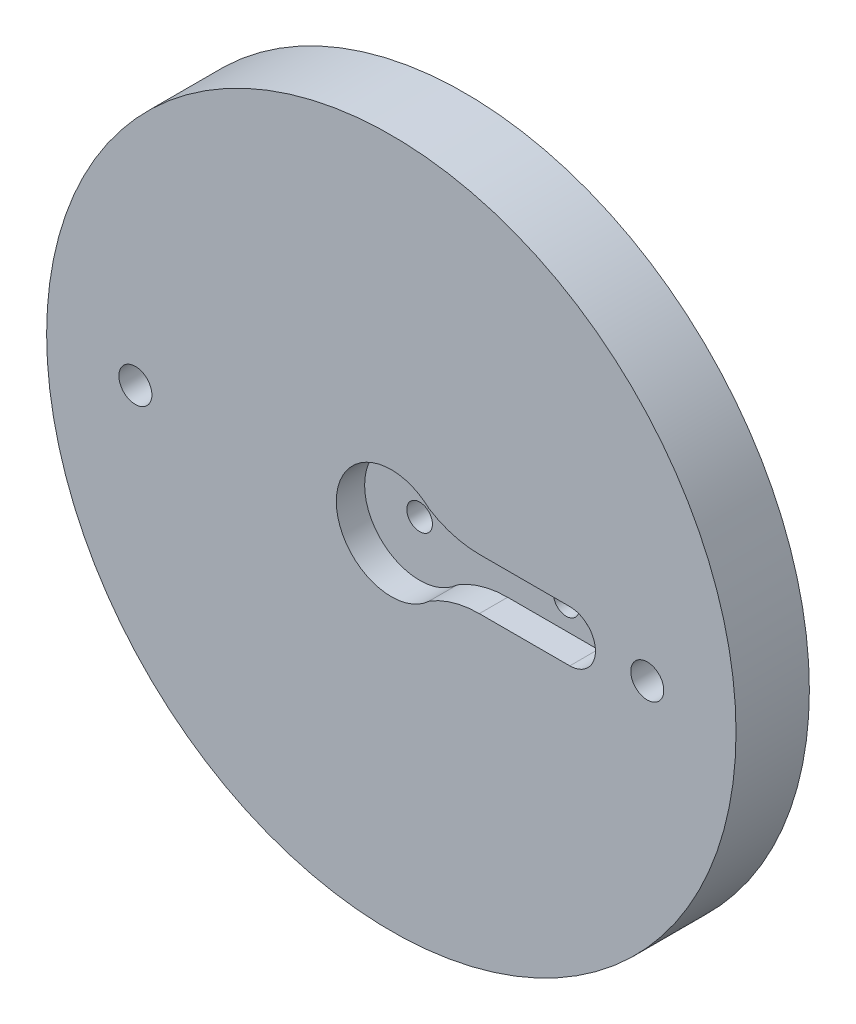
ISO-10303-21;
HEADER;
FILE_DESCRIPTION(('STEP AP214'),'2;1');
FILE_NAME('part.step','',(''),(''),'','','');
FILE_SCHEMA(('AUTOMOTIVE_DESIGN { 1 0 10303 214 1 1 1 1 }'));
ENDSEC;
DATA;
#1=APPLICATION_CONTEXT('core data for automotive mechanical design processes');
#2=APPLICATION_PROTOCOL_DEFINITION('international standard','automotive_design',2000,#1);
#3=PRODUCT_CONTEXT('',#1,'mechanical');
#4=PRODUCT('Part','Part','',(#3));
#5=PRODUCT_RELATED_PRODUCT_CATEGORY('part','',(#4));
#6=PRODUCT_DEFINITION_FORMATION('','',#4);
#7=PRODUCT_DEFINITION_CONTEXT('part definition',#1,'design');
#8=PRODUCT_DEFINITION('design','',#6,#7);
#9=PRODUCT_DEFINITION_SHAPE('','',#8);
#10=(LENGTH_UNIT() NAMED_UNIT(*) SI_UNIT(.MILLI.,.METRE.));
#11=(NAMED_UNIT(*) PLANE_ANGLE_UNIT() SI_UNIT($,.RADIAN.));
#12=(NAMED_UNIT(*) SI_UNIT($,.STERADIAN.) SOLID_ANGLE_UNIT());
#13=UNCERTAINTY_MEASURE_WITH_UNIT(LENGTH_MEASURE(1.E-05),#10,'distance_accuracy_value','');
#14=(GEOMETRIC_REPRESENTATION_CONTEXT(3) GLOBAL_UNCERTAINTY_ASSIGNED_CONTEXT((#13)) GLOBAL_UNIT_ASSIGNED_CONTEXT((#10,
#11,#12)) REPRESENTATION_CONTEXT('',''));
#15=CARTESIAN_POINT('',(0.,0.,0.));
#16=DIRECTION('',(0.,0.,1.));
#17=DIRECTION('',(1.,0.,0.));
#18=AXIS2_PLACEMENT_3D('',#15,#16,#17);
#19=CARTESIAN_POINT('',(0.,0.,10.));
#20=DIRECTION('',(0.,0.,1.));
#21=DIRECTION('',(1.,0.,0.));
#22=AXIS2_PLACEMENT_3D('',#19,#20,#21);
#23=PLANE('',#22);
#24=CARTESIAN_POINT('',(12.,16.5,10.));
#25=DIRECTION('',(0.,0.,-1.));
#26=DIRECTION('',(-1.,0.,0.));
#27=AXIS2_PLACEMENT_3D('',#24,#25,#26);
#28=CIRCLE('',#27,13.);
#29=CARTESIAN_POINT('',(12.,3.50000000000002,10.));
#30=VERTEX_POINT('',#29);
#31=CARTESIAN_POINT('',(5.15357012521902,5.44891869681042,10.));
#32=VERTEX_POINT('',#31);
#33=EDGE_CURVE('E64',#30,#32,#28,.T.);
#34=ORIENTED_EDGE('',*,*,#33,.F.);
#35=DIRECTION('',(-1.,0.,0.));
#36=VECTOR('',#35,1.);
#37=CARTESIAN_POINT('',(24.33053856,3.50000000000002,10.));
#38=LINE('',#37,#36);
#39=CARTESIAN_POINT('',(24.33053856,3.50000000000002,10.));
#40=VERTEX_POINT('',#39);
#41=EDGE_CURVE('E159',#40,#30,#38,.T.);
#42=ORIENTED_EDGE('',*,*,#41,.F.);
#43=CARTESIAN_POINT('',(24.33053856,0.,10.));
#44=DIRECTION('',(0.,0.,1.));
#45=DIRECTION('',(1.,0.,0.));
#46=AXIS2_PLACEMENT_3D('',#43,#44,#45);
#47=CIRCLE('',#46,3.5);
#48=CARTESIAN_POINT('',(24.33053856,-3.49999999999999,10.));
#49=VERTEX_POINT('',#48);
#50=EDGE_CURVE('E156',#49,#40,#47,.T.);
#51=ORIENTED_EDGE('',*,*,#50,.F.);
#52=DIRECTION('',(1.,0.,0.));
#53=VECTOR('',#52,1.);
#54=CARTESIAN_POINT('',(24.33053856,-3.49999999999999,10.));
#55=LINE('',#54,#53);
#56=CARTESIAN_POINT('',(12.,-3.49999999999999,10.));
#57=VERTEX_POINT('',#56);
#58=EDGE_CURVE('E112',#57,#49,#55,.T.);
#59=ORIENTED_EDGE('',*,*,#58,.F.);
#60=CARTESIAN_POINT('',(12.,-16.5,10.));
#61=DIRECTION('',(0.,0.,-1.));
#62=DIRECTION('',(1.,0.,0.));
#63=AXIS2_PLACEMENT_3D('',#60,#61,#62);
#64=CIRCLE('',#63,13.);
#65=CARTESIAN_POINT('',(5.15357012521903,-5.4489186968104,10.));
#66=VERTEX_POINT('',#65);
#67=EDGE_CURVE('E150',#66,#57,#64,.T.);
#68=ORIENTED_EDGE('',*,*,#67,.F.);
#69=CARTESIAN_POINT('',(0.,0.,10.));
#70=DIRECTION('',(0.,0.,1.));
#71=DIRECTION('',(1.,0.,0.));
#72=AXIS2_PLACEMENT_3D('',#69,#70,#71);
#73=CIRCLE('',#72,7.50000000000001);
#74=EDGE_CURVE('E145',#32,#66,#73,.T.);
#75=ORIENTED_EDGE('',*,*,#74,.F.);
#76=EDGE_LOOP('',(#34,#42,#51,#59,#68,#75));
#77=FACE_BOUND('',#76,.T.);
#78=CARTESIAN_POINT('',(-34.897005385,0.,10.));
#79=DIRECTION('',(0.,0.,1.));
#80=DIRECTION('',(1.,0.,0.));
#81=AXIS2_PLACEMENT_3D('',#78,#79,#80);
#82=CIRCLE('',#81,2.25);
#83=CARTESIAN_POINT('',(-32.647005385,0.,10.));
#84=VERTEX_POINT('',#83);
#85=EDGE_CURVE('E183',#84,#84,#82,.T.);
#86=ORIENTED_EDGE('',*,*,#85,.F.);
#87=EDGE_LOOP('',(#86));
#88=FACE_BOUND('',#87,.T.);
#89=CARTESIAN_POINT('',(0.,0.,10.));
#90=DIRECTION('',(0.,0.,1.));
#91=DIRECTION('',(1.,0.,0.));
#92=AXIS2_PLACEMENT_3D('',#89,#90,#91);
#93=CIRCLE('',#92,47.);
#94=CARTESIAN_POINT('',(47.,0.,10.));
#95=VERTEX_POINT('',#94);
#96=EDGE_CURVE('E11',#95,#95,#93,.T.);
#97=ORIENTED_EDGE('',*,*,#96,.T.);
#98=EDGE_LOOP('',(#97));
#99=FACE_BOUND('',#98,.T.);
#100=CARTESIAN_POINT('',(34.897005385,0.,10.));
#101=DIRECTION('',(0.,0.,1.));
#102=DIRECTION('',(-1.,0.,0.));
#103=AXIS2_PLACEMENT_3D('',#100,#101,#102);
#104=CIRCLE('',#103,2.25);
#105=CARTESIAN_POINT('',(32.647005385,0.,10.));
#106=VERTEX_POINT('',#105);
#107=EDGE_CURVE('E175',#106,#106,#104,.T.);
#108=ORIENTED_EDGE('',*,*,#107,.F.);
#109=EDGE_LOOP('',(#108));
#110=FACE_BOUND('',#109,.T.);
#111=ADVANCED_FACE('F48',(#77,#88,#99,#110),#23,.T.);
#112=CARTESIAN_POINT('',(0.,0.,0.));
#113=DIRECTION('',(0.,0.,1.));
#114=DIRECTION('',(1.,0.,0.));
#115=AXIS2_PLACEMENT_3D('',#112,#113,#114);
#116=PLANE('',#115);
#117=CARTESIAN_POINT('',(0.,0.,0.));
#118=DIRECTION('',(0.,0.,1.));
#119=DIRECTION('',(1.,0.,0.));
#120=AXIS2_PLACEMENT_3D('',#117,#118,#119);
#121=CIRCLE('',#120,1.75);
#122=CARTESIAN_POINT('',(1.75,0.,0.));
#123=VERTEX_POINT('',#122);
#124=EDGE_CURVE('E146',#123,#123,#121,.T.);
#125=ORIENTED_EDGE('',*,*,#124,.T.);
#126=EDGE_LOOP('',(#125));
#127=FACE_BOUND('',#126,.T.);
#128=CARTESIAN_POINT('',(20.,0.,0.));
#129=DIRECTION('',(0.,0.,1.));
#130=DIRECTION('',(1.,0.,0.));
#131=AXIS2_PLACEMENT_3D('',#128,#129,#130);
#132=CIRCLE('',#131,1.75);
#133=CARTESIAN_POINT('',(21.75,0.,0.));
#134=VERTEX_POINT('',#133);
#135=EDGE_CURVE('E253',#134,#134,#132,.T.);
#136=ORIENTED_EDGE('',*,*,#135,.T.);
#137=EDGE_LOOP('',(#136));
#138=FACE_BOUND('',#137,.T.);
#139=CARTESIAN_POINT('',(24.,0.,0.));
#140=DIRECTION('',(0.,0.,1.));
#141=DIRECTION('',(1.,0.,0.));
#142=AXIS2_PLACEMENT_3D('',#139,#140,#141);
#143=CIRCLE('',#142,1.75);
#144=CARTESIAN_POINT('',(25.75,0.,0.));
#145=VERTEX_POINT('',#144);
#146=EDGE_CURVE('E235',#145,#145,#143,.T.);
#147=ORIENTED_EDGE('',*,*,#146,.T.);
#148=EDGE_LOOP('',(#147));
#149=FACE_BOUND('',#148,.T.);
#150=CARTESIAN_POINT('',(0.,0.,0.));
#151=DIRECTION('',(0.,0.,1.));
#152=DIRECTION('',(1.,0.,0.));
#153=AXIS2_PLACEMENT_3D('',#150,#151,#152);
#154=CIRCLE('',#153,47.);
#155=CARTESIAN_POINT('',(47.,0.,0.));
#156=VERTEX_POINT('',#155);
#157=EDGE_CURVE('E52',#156,#156,#154,.T.);
#158=ORIENTED_EDGE('',*,*,#157,.F.);
#159=EDGE_LOOP('',(#158));
#160=FACE_BOUND('',#159,.T.);
#161=CARTESIAN_POINT('',(-34.897005385,0.,0.));
#162=DIRECTION('',(0.,0.,1.));
#163=DIRECTION('',(1.,0.,0.));
#164=AXIS2_PLACEMENT_3D('',#161,#162,#163);
#165=CIRCLE('',#164,2.25);
#166=CARTESIAN_POINT('',(-32.647005385,0.,0.));
#167=VERTEX_POINT('',#166);
#168=EDGE_CURVE('E179',#167,#167,#165,.T.);
#169=ORIENTED_EDGE('',*,*,#168,.T.);
#170=EDGE_LOOP('',(#169));
#171=FACE_BOUND('',#170,.T.);
#172=CARTESIAN_POINT('',(34.897005385,0.,0.));
#173=DIRECTION('',(0.,0.,1.));
#174=DIRECTION('',(-1.,0.,0.));
#175=AXIS2_PLACEMENT_3D('',#172,#173,#174);
#176=CIRCLE('',#175,2.25);
#177=CARTESIAN_POINT('',(32.647005385,0.,0.));
#178=VERTEX_POINT('',#177);
#179=EDGE_CURVE('E165',#178,#178,#176,.T.);
#180=ORIENTED_EDGE('',*,*,#179,.T.);
#181=EDGE_LOOP('',(#180));
#182=FACE_BOUND('',#181,.T.);
#183=ADVANCED_FACE('F192',(#127,#138,#149,#160,#171,#182),#116,.F.);
#184=CARTESIAN_POINT('',(0.,0.,10.));
#185=DIRECTION('',(0.,0.,-1.));
#186=DIRECTION('',(-1.,0.,0.));
#187=AXIS2_PLACEMENT_3D('',#184,#185,#186);
#188=CYLINDRICAL_SURFACE('',#187,47.);
#189=ORIENTED_EDGE('',*,*,#96,.F.);
#190=EDGE_LOOP('',(#189));
#191=FACE_BOUND('',#190,.T.);
#192=ORIENTED_EDGE('',*,*,#157,.T.);
#193=EDGE_LOOP('',(#192));
#194=FACE_BOUND('',#193,.T.);
#195=ADVANCED_FACE('F50',(#191,#194),#188,.T.);
#196=CARTESIAN_POINT('',(-34.897005385,0.,10.));
#197=DIRECTION('',(0.,0.,-1.));
#198=DIRECTION('',(-1.,0.,0.));
#199=AXIS2_PLACEMENT_3D('',#196,#197,#198);
#200=CYLINDRICAL_SURFACE('',#199,2.25);
#201=ORIENTED_EDGE('',*,*,#85,.T.);
#202=EDGE_LOOP('',(#201));
#203=FACE_BOUND('',#202,.T.);
#204=ORIENTED_EDGE('',*,*,#168,.F.);
#205=EDGE_LOOP('',(#204));
#206=FACE_BOUND('',#205,.T.);
#207=ADVANCED_FACE('F195',(#203,#206),#200,.F.);
#208=CARTESIAN_POINT('',(34.897005385,0.,10.));
#209=DIRECTION('',(0.,0.,-1.));
#210=DIRECTION('',(-1.,0.,0.));
#211=AXIS2_PLACEMENT_3D('',#208,#209,#210);
#212=CYLINDRICAL_SURFACE('',#211,2.25);
#213=ORIENTED_EDGE('',*,*,#107,.T.);
#214=EDGE_LOOP('',(#213));
#215=FACE_BOUND('',#214,.T.);
#216=ORIENTED_EDGE('',*,*,#179,.F.);
#217=EDGE_LOOP('',(#216));
#218=FACE_BOUND('',#217,.T.);
#219=ADVANCED_FACE('F197',(#215,#218),#212,.F.);
#220=CARTESIAN_POINT('',(12.,16.5,6.14));
#221=DIRECTION('',(0.,0.,1.));
#222=DIRECTION('',(1.,0.,0.));
#223=AXIS2_PLACEMENT_3D('',#220,#221,#222);
#224=CYLINDRICAL_SURFACE('',#223,13.);
#225=ORIENTED_EDGE('',*,*,#33,.T.);
#226=DIRECTION('',(0.,0.,1.));
#227=VECTOR('',#226,1.);
#228=CARTESIAN_POINT('',(5.15357012521902,5.44891869681042,6.14));
#229=LINE('',#228,#227);
#230=CARTESIAN_POINT('',(5.15357012521902,5.44891869681042,6.14));
#231=VERTEX_POINT('',#230);
#232=EDGE_CURVE('E94',#231,#32,#229,.T.);
#233=ORIENTED_EDGE('',*,*,#232,.F.);
#234=CARTESIAN_POINT('',(12.,16.5,6.14));
#235=DIRECTION('',(0.,0.,-1.));
#236=DIRECTION('',(-1.,0.,0.));
#237=AXIS2_PLACEMENT_3D('',#234,#235,#236);
#238=CIRCLE('',#237,13.);
#239=CARTESIAN_POINT('',(12.,3.50000000000002,6.14));
#240=VERTEX_POINT('',#239);
#241=EDGE_CURVE('E162',#240,#231,#238,.T.);
#242=ORIENTED_EDGE('',*,*,#241,.F.);
#243=DIRECTION('',(0.,0.,1.));
#244=VECTOR('',#243,1.);
#245=CARTESIAN_POINT('',(12.,3.50000000000002,6.14));
#246=LINE('',#245,#244);
#247=EDGE_CURVE('E72',#240,#30,#246,.T.);
#248=ORIENTED_EDGE('',*,*,#247,.T.);
#249=EDGE_LOOP('',(#225,#233,#242,#248));
#250=FACE_BOUND('',#249,.T.);
#251=ADVANCED_FACE('F203',(#250),#224,.T.);
#252=CARTESIAN_POINT('',(24.33053856,3.50000000000002,6.14));
#253=DIRECTION('',(0.,1.,0.));
#254=DIRECTION('',(-1.,0.,0.));
#255=AXIS2_PLACEMENT_3D('',#252,#253,#254);
#256=PLANE('',#255);
#257=ORIENTED_EDGE('',*,*,#41,.T.);
#258=ORIENTED_EDGE('',*,*,#247,.F.);
#259=DIRECTION('',(-1.,0.,0.));
#260=VECTOR('',#259,1.);
#261=CARTESIAN_POINT('',(24.33053856,3.50000000000002,6.14));
#262=LINE('',#261,#260);
#263=CARTESIAN_POINT('',(24.33053856,3.50000000000002,6.14));
#264=VERTEX_POINT('',#263);
#265=EDGE_CURVE('E126',#264,#240,#262,.T.);
#266=ORIENTED_EDGE('',*,*,#265,.F.);
#267=DIRECTION('',(0.,0.,1.));
#268=VECTOR('',#267,1.);
#269=CARTESIAN_POINT('',(24.33053856,3.50000000000002,6.14));
#270=LINE('',#269,#268);
#271=EDGE_CURVE('E117',#264,#40,#270,.T.);
#272=ORIENTED_EDGE('',*,*,#271,.T.);
#273=EDGE_LOOP('',(#257,#258,#266,#272));
#274=FACE_BOUND('',#273,.T.);
#275=ADVANCED_FACE('F303',(#274),#256,.F.);
#276=CARTESIAN_POINT('',(24.33053856,0.,6.14));
#277=DIRECTION('',(0.,0.,1.));
#278=DIRECTION('',(1.,0.,0.));
#279=AXIS2_PLACEMENT_3D('',#276,#277,#278);
#280=CYLINDRICAL_SURFACE('',#279,3.5);
#281=ORIENTED_EDGE('',*,*,#50,.T.);
#282=ORIENTED_EDGE('',*,*,#271,.F.);
#283=CARTESIAN_POINT('',(24.33053856,0.,6.14));
#284=DIRECTION('',(0.,0.,1.));
#285=DIRECTION('',(1.,0.,0.));
#286=AXIS2_PLACEMENT_3D('',#283,#284,#285);
#287=CIRCLE('',#286,3.5);
#288=CARTESIAN_POINT('',(24.33053856,-3.49999999999999,6.14));
#289=VERTEX_POINT('',#288);
#290=EDGE_CURVE('E121',#289,#264,#287,.T.);
#291=ORIENTED_EDGE('',*,*,#290,.F.);
#292=DIRECTION('',(0.,0.,1.));
#293=VECTOR('',#292,1.);
#294=CARTESIAN_POINT('',(24.33053856,-3.49999999999999,6.14));
#295=LINE('',#294,#293);
#296=EDGE_CURVE('E105',#289,#49,#295,.T.);
#297=ORIENTED_EDGE('',*,*,#296,.T.);
#298=EDGE_LOOP('',(#281,#282,#291,#297));
#299=FACE_BOUND('',#298,.T.);
#300=ADVANCED_FACE('F122',(#299),#280,.F.);
#301=CARTESIAN_POINT('',(24.33053856,-3.49999999999999,6.14));
#302=DIRECTION('',(0.,-1.,0.));
#303=DIRECTION('',(1.,0.,0.));
#304=AXIS2_PLACEMENT_3D('',#301,#302,#303);
#305=PLANE('',#304);
#306=ORIENTED_EDGE('',*,*,#58,.T.);
#307=ORIENTED_EDGE('',*,*,#296,.F.);
#308=DIRECTION('',(1.,0.,0.));
#309=VECTOR('',#308,1.);
#310=CARTESIAN_POINT('',(24.33053856,-3.49999999999999,6.14));
#311=LINE('',#310,#309);
#312=CARTESIAN_POINT('',(12.,-3.49999999999999,6.14));
#313=VERTEX_POINT('',#312);
#314=EDGE_CURVE('E109',#313,#289,#311,.T.);
#315=ORIENTED_EDGE('',*,*,#314,.F.);
#316=DIRECTION('',(0.,0.,1.));
#317=VECTOR('',#316,1.);
#318=CARTESIAN_POINT('',(12.,-3.49999999999999,6.14));
#319=LINE('',#318,#317);
#320=EDGE_CURVE('E118',#313,#57,#319,.T.);
#321=ORIENTED_EDGE('',*,*,#320,.T.);
#322=EDGE_LOOP('',(#306,#307,#315,#321));
#323=FACE_BOUND('',#322,.T.);
#324=ADVANCED_FACE('F107',(#323),#305,.F.);
#325=CARTESIAN_POINT('',(12.,-16.5,6.14));
#326=DIRECTION('',(0.,0.,1.));
#327=DIRECTION('',(1.,0.,0.));
#328=AXIS2_PLACEMENT_3D('',#325,#326,#327);
#329=CYLINDRICAL_SURFACE('',#328,13.);
#330=ORIENTED_EDGE('',*,*,#67,.T.);
#331=ORIENTED_EDGE('',*,*,#320,.F.);
#332=CARTESIAN_POINT('',(12.,-16.5,6.14));
#333=DIRECTION('',(0.,0.,-1.));
#334=DIRECTION('',(1.,0.,0.));
#335=AXIS2_PLACEMENT_3D('',#332,#333,#334);
#336=CIRCLE('',#335,13.);
#337=CARTESIAN_POINT('',(5.15357012521903,-5.4489186968104,6.14));
#338=VERTEX_POINT('',#337);
#339=EDGE_CURVE('E132',#338,#313,#336,.T.);
#340=ORIENTED_EDGE('',*,*,#339,.F.);
#341=DIRECTION('',(0.,0.,1.));
#342=VECTOR('',#341,1.);
#343=CARTESIAN_POINT('',(5.15357012521903,-5.4489186968104,6.14));
#344=LINE('',#343,#342);
#345=EDGE_CURVE('E170',#338,#66,#344,.T.);
#346=ORIENTED_EDGE('',*,*,#345,.T.);
#347=EDGE_LOOP('',(#330,#331,#340,#346));
#348=FACE_BOUND('',#347,.T.);
#349=ADVANCED_FACE('F296',(#348),#329,.T.);
#350=CARTESIAN_POINT('',(0.,0.,6.14));
#351=DIRECTION('',(0.,0.,1.));
#352=DIRECTION('',(1.,0.,0.));
#353=AXIS2_PLACEMENT_3D('',#350,#351,#352);
#354=CYLINDRICAL_SURFACE('',#353,7.50000000000001);
#355=ORIENTED_EDGE('',*,*,#74,.T.);
#356=ORIENTED_EDGE('',*,*,#345,.F.);
#357=CARTESIAN_POINT('',(0.,0.,6.14));
#358=DIRECTION('',(0.,0.,1.));
#359=DIRECTION('',(1.,0.,0.));
#360=AXIS2_PLACEMENT_3D('',#357,#358,#359);
#361=CIRCLE('',#360,7.50000000000001);
#362=EDGE_CURVE('E137',#231,#338,#361,.T.);
#363=ORIENTED_EDGE('',*,*,#362,.F.);
#364=ORIENTED_EDGE('',*,*,#232,.T.);
#365=EDGE_LOOP('',(#355,#356,#363,#364));
#366=FACE_BOUND('',#365,.T.);
#367=ADVANCED_FACE('F291',(#366),#354,.F.);
#368=CARTESIAN_POINT('',(12.,16.5,6.14));
#369=DIRECTION('',(0.,0.,-1.));
#370=DIRECTION('',(-1.,0.,0.));
#371=AXIS2_PLACEMENT_3D('',#368,#369,#370);
#372=PLANE('',#371);
#373=CARTESIAN_POINT('',(0.,0.,6.14));
#374=DIRECTION('',(0.,0.,1.));
#375=DIRECTION('',(1.,0.,0.));
#376=AXIS2_PLACEMENT_3D('',#373,#374,#375);
#377=CIRCLE('',#376,1.75);
#378=CARTESIAN_POINT('',(1.75,0.,6.14));
#379=VERTEX_POINT('',#378);
#380=EDGE_CURVE('E240',#379,#379,#377,.T.);
#381=ORIENTED_EDGE('',*,*,#380,.F.);
#382=EDGE_LOOP('',(#381));
#383=FACE_BOUND('',#382,.T.);
#384=CARTESIAN_POINT('',(20.,0.,6.14));
#385=DIRECTION('',(0.,0.,1.));
#386=DIRECTION('',(1.,0.,0.));
#387=AXIS2_PLACEMENT_3D('',#384,#385,#386);
#388=CIRCLE('',#387,1.75);
#389=CARTESIAN_POINT('',(21.75,0.,6.14));
#390=VERTEX_POINT('',#389);
#391=EDGE_CURVE('E244',#390,#390,#388,.T.);
#392=ORIENTED_EDGE('',*,*,#391,.F.);
#393=EDGE_LOOP('',(#392));
#394=FACE_BOUND('',#393,.T.);
#395=CARTESIAN_POINT('',(24.,0.,6.14));
#396=DIRECTION('',(0.,0.,1.));
#397=DIRECTION('',(1.,0.,0.));
#398=AXIS2_PLACEMENT_3D('',#395,#396,#397);
#399=CIRCLE('',#398,1.75);
#400=CARTESIAN_POINT('',(25.75,0.,6.14));
#401=VERTEX_POINT('',#400);
#402=EDGE_CURVE('E250',#401,#401,#399,.T.);
#403=ORIENTED_EDGE('',*,*,#402,.F.);
#404=EDGE_LOOP('',(#403));
#405=FACE_BOUND('',#404,.T.);
#406=ORIENTED_EDGE('',*,*,#241,.T.);
#407=ORIENTED_EDGE('',*,*,#362,.T.);
#408=ORIENTED_EDGE('',*,*,#339,.T.);
#409=ORIENTED_EDGE('',*,*,#314,.T.);
#410=ORIENTED_EDGE('',*,*,#290,.T.);
#411=ORIENTED_EDGE('',*,*,#265,.T.);
#412=EDGE_LOOP('',(#406,#407,#408,#409,#410,#411));
#413=FACE_BOUND('',#412,.T.);
#414=ADVANCED_FACE('F129',(#383,#394,#405,#413),#372,.F.);
#415=CARTESIAN_POINT('',(24.,0.,0.));
#416=DIRECTION('',(0.,0.,1.));
#417=DIRECTION('',(1.,0.,0.));
#418=AXIS2_PLACEMENT_3D('',#415,#416,#417);
#419=CYLINDRICAL_SURFACE('',#418,1.75);
#420=ORIENTED_EDGE('',*,*,#146,.F.);
#421=EDGE_LOOP('',(#420));
#422=FACE_BOUND('',#421,.T.);
#423=ORIENTED_EDGE('',*,*,#402,.T.);
#424=EDGE_LOOP('',(#423));
#425=FACE_BOUND('',#424,.T.);
#426=ADVANCED_FACE('F283',(#422,#425),#419,.F.);
#427=CARTESIAN_POINT('',(20.,0.,0.));
#428=DIRECTION('',(0.,0.,1.));
#429=DIRECTION('',(1.,0.,0.));
#430=AXIS2_PLACEMENT_3D('',#427,#428,#429);
#431=CYLINDRICAL_SURFACE('',#430,1.75);
#432=ORIENTED_EDGE('',*,*,#135,.F.);
#433=EDGE_LOOP('',(#432));
#434=FACE_BOUND('',#433,.T.);
#435=ORIENTED_EDGE('',*,*,#391,.T.);
#436=EDGE_LOOP('',(#435));
#437=FACE_BOUND('',#436,.T.);
#438=ADVANCED_FACE('F286',(#434,#437),#431,.F.);
#439=CARTESIAN_POINT('',(0.,0.,0.));
#440=DIRECTION('',(0.,0.,1.));
#441=DIRECTION('',(1.,0.,0.));
#442=AXIS2_PLACEMENT_3D('',#439,#440,#441);
#443=CYLINDRICAL_SURFACE('',#442,1.75);
#444=ORIENTED_EDGE('',*,*,#124,.F.);
#445=EDGE_LOOP('',(#444));
#446=FACE_BOUND('',#445,.T.);
#447=ORIENTED_EDGE('',*,*,#380,.T.);
#448=EDGE_LOOP('',(#447));
#449=FACE_BOUND('',#448,.T.);
#450=ADVANCED_FACE('F360',(#446,#449),#443,.F.);
#451=CLOSED_SHELL('',(#111,#183,#195,#207,#219,#251,#275,#300,#324,#349,#367,#414,#426,#438,#450));
#452=MANIFOLD_SOLID_BREP('B2',#451);
#453=ADVANCED_BREP_SHAPE_REPRESENTATION('',(#18,#452),#14);
#454=SHAPE_DEFINITION_REPRESENTATION(#9,#453);
ENDSEC;
END-ISO-10303-21;
